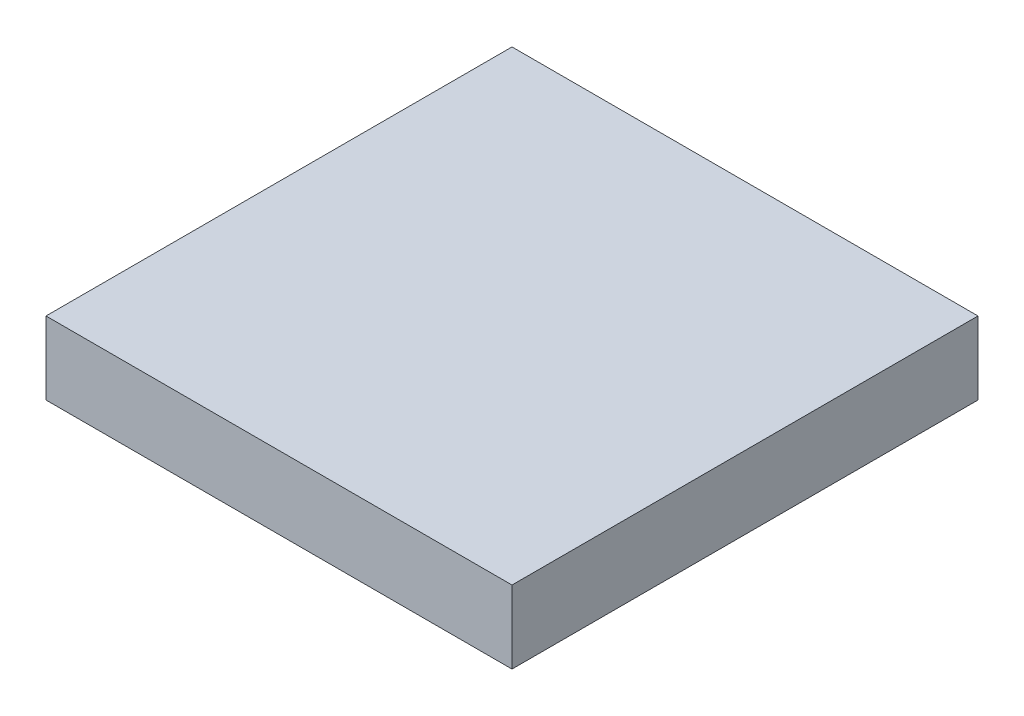
ISO-10303-21;
HEADER;
FILE_DESCRIPTION(('STEP AP214'),'2;1');
FILE_NAME('part.step','',(''),(''),'','','');
FILE_SCHEMA(('AUTOMOTIVE_DESIGN { 1 0 10303 214 1 1 1 1 }'));
ENDSEC;
DATA;
#1=APPLICATION_CONTEXT('core data for automotive mechanical design processes');
#2=APPLICATION_PROTOCOL_DEFINITION('international standard','automotive_design',2000,#1);
#3=PRODUCT_CONTEXT('',#1,'mechanical');
#4=PRODUCT('Part','Part','',(#3));
#5=PRODUCT_RELATED_PRODUCT_CATEGORY('part','',(#4));
#6=PRODUCT_DEFINITION_FORMATION('','',#4);
#7=PRODUCT_DEFINITION_CONTEXT('part definition',#1,'design');
#8=PRODUCT_DEFINITION('design','',#6,#7);
#9=PRODUCT_DEFINITION_SHAPE('','',#8);
#10=(LENGTH_UNIT() NAMED_UNIT(*) SI_UNIT(.MILLI.,.METRE.));
#11=(NAMED_UNIT(*) PLANE_ANGLE_UNIT() SI_UNIT($,.RADIAN.));
#12=(NAMED_UNIT(*) SI_UNIT($,.STERADIAN.) SOLID_ANGLE_UNIT());
#13=UNCERTAINTY_MEASURE_WITH_UNIT(LENGTH_MEASURE(1.E-05),#10,'distance_accuracy_value','');
#14=(GEOMETRIC_REPRESENTATION_CONTEXT(3) GLOBAL_UNCERTAINTY_ASSIGNED_CONTEXT((#13)) GLOBAL_UNIT_ASSIGNED_CONTEXT((#10,
#11,#12)) REPRESENTATION_CONTEXT('',''));
#15=CARTESIAN_POINT('',(0.,0.,0.));
#16=DIRECTION('',(0.,0.,1.));
#17=DIRECTION('',(1.,0.,0.));
#18=AXIS2_PLACEMENT_3D('',#15,#16,#17);
#19=CARTESIAN_POINT('',(-31.9999999999999,25.,64.5));
#20=DIRECTION('',(1.,0.,0.));
#21=DIRECTION('',(0.,0.,-1.));
#22=AXIS2_PLACEMENT_3D('',#19,#20,#21);
#23=PLANE('',#22);
#24=DIRECTION('',(0.,0.,1.));
#25=VECTOR('',#24,1.);
#26=CARTESIAN_POINT('',(-31.9999999999999,15.,64.5));
#27=LINE('',#26,#25);
#28=CARTESIAN_POINT('',(-31.9999999999999,15.,0.499999999999999));
#29=VERTEX_POINT('',#28);
#30=CARTESIAN_POINT('',(-31.9999999999999,15.,64.5));
#31=VERTEX_POINT('',#30);
#32=EDGE_CURVE('E102',#29,#31,#27,.T.);
#33=ORIENTED_EDGE('',*,*,#32,.T.);
#34=DIRECTION('',(0.,-1.,0.));
#35=VECTOR('',#34,1.);
#36=CARTESIAN_POINT('',(-31.9999999999999,25.,64.5));
#37=LINE('',#36,#35);
#38=CARTESIAN_POINT('',(-31.9999999999999,25.,64.5));
#39=VERTEX_POINT('',#38);
#40=EDGE_CURVE('E11',#39,#31,#37,.T.);
#41=ORIENTED_EDGE('',*,*,#40,.F.);
#42=DIRECTION('',(0.,0.,1.));
#43=VECTOR('',#42,1.);
#44=CARTESIAN_POINT('',(-31.9999999999999,25.,64.5));
#45=LINE('',#44,#43);
#46=CARTESIAN_POINT('',(-31.9999999999999,25.,0.499999999999999));
#47=VERTEX_POINT('',#46);
#48=EDGE_CURVE('E90',#47,#39,#45,.T.);
#49=ORIENTED_EDGE('',*,*,#48,.F.);
#50=DIRECTION('',(0.,-1.,0.));
#51=VECTOR('',#50,1.);
#52=CARTESIAN_POINT('',(-31.9999999999999,25.,0.499999999999999));
#53=LINE('',#52,#51);
#54=EDGE_CURVE('E98',#47,#29,#53,.T.);
#55=ORIENTED_EDGE('',*,*,#54,.T.);
#56=EDGE_LOOP('',(#33,#41,#49,#55));
#57=FACE_BOUND('',#56,.T.);
#58=ADVANCED_FACE('F39',(#57),#23,.F.);
#59=CARTESIAN_POINT('',(32.,25.,64.5));
#60=DIRECTION('',(0.,0.,-1.));
#61=DIRECTION('',(-1.,0.,0.));
#62=AXIS2_PLACEMENT_3D('',#59,#60,#61);
#63=PLANE('',#62);
#64=DIRECTION('',(1.,0.,0.));
#65=VECTOR('',#64,1.);
#66=CARTESIAN_POINT('',(32.,15.,64.5));
#67=LINE('',#66,#65);
#68=CARTESIAN_POINT('',(32.,15.,64.5));
#69=VERTEX_POINT('',#68);
#70=EDGE_CURVE('E94',#31,#69,#67,.T.);
#71=ORIENTED_EDGE('',*,*,#70,.T.);
#72=DIRECTION('',(0.,-1.,0.));
#73=VECTOR('',#72,1.);
#74=CARTESIAN_POINT('',(32.,25.,64.5));
#75=LINE('',#74,#73);
#76=CARTESIAN_POINT('',(32.,25.,64.5));
#77=VERTEX_POINT('',#76);
#78=EDGE_CURVE('E47',#77,#69,#75,.T.);
#79=ORIENTED_EDGE('',*,*,#78,.F.);
#80=DIRECTION('',(1.,0.,0.));
#81=VECTOR('',#80,1.);
#82=CARTESIAN_POINT('',(32.,25.,64.5));
#83=LINE('',#82,#81);
#84=EDGE_CURVE('E85',#39,#77,#83,.T.);
#85=ORIENTED_EDGE('',*,*,#84,.F.);
#86=ORIENTED_EDGE('',*,*,#40,.T.);
#87=EDGE_LOOP('',(#71,#79,#85,#86));
#88=FACE_BOUND('',#87,.T.);
#89=ADVANCED_FACE('F93',(#88),#63,.F.);
#90=CARTESIAN_POINT('',(32.,25.,0.499999999999997));
#91=DIRECTION('',(-1.,0.,0.));
#92=DIRECTION('',(0.,0.,1.));
#93=AXIS2_PLACEMENT_3D('',#90,#91,#92);
#94=PLANE('',#93);
#95=DIRECTION('',(0.,0.,-1.));
#96=VECTOR('',#95,1.);
#97=CARTESIAN_POINT('',(32.,15.,0.499999999999997));
#98=LINE('',#97,#96);
#99=CARTESIAN_POINT('',(32.,15.,0.499999999999997));
#100=VERTEX_POINT('',#99);
#101=EDGE_CURVE('E72',#69,#100,#98,.T.);
#102=ORIENTED_EDGE('',*,*,#101,.T.);
#103=DIRECTION('',(0.,-1.,0.));
#104=VECTOR('',#103,1.);
#105=CARTESIAN_POINT('',(32.,25.,0.499999999999997));
#106=LINE('',#105,#104);
#107=CARTESIAN_POINT('',(32.,25.,0.499999999999997));
#108=VERTEX_POINT('',#107);
#109=EDGE_CURVE('E95',#108,#100,#106,.T.);
#110=ORIENTED_EDGE('',*,*,#109,.F.);
#111=DIRECTION('',(0.,0.,-1.));
#112=VECTOR('',#111,1.);
#113=CARTESIAN_POINT('',(32.,25.,0.499999999999997));
#114=LINE('',#113,#112);
#115=EDGE_CURVE('E88',#77,#108,#114,.T.);
#116=ORIENTED_EDGE('',*,*,#115,.F.);
#117=ORIENTED_EDGE('',*,*,#78,.T.);
#118=EDGE_LOOP('',(#102,#110,#116,#117));
#119=FACE_BOUND('',#118,.T.);
#120=ADVANCED_FACE('F96',(#119),#94,.F.);
#121=CARTESIAN_POINT('',(-31.9999999999999,25.,0.499999999999999));
#122=DIRECTION('',(0.,0.,1.));
#123=DIRECTION('',(1.,0.,0.));
#124=AXIS2_PLACEMENT_3D('',#121,#122,#123);
#125=PLANE('',#124);
#126=DIRECTION('',(-1.,0.,0.));
#127=VECTOR('',#126,1.);
#128=CARTESIAN_POINT('',(-31.9999999999999,15.,0.499999999999999));
#129=LINE('',#128,#127);
#130=EDGE_CURVE('E78',#100,#29,#129,.T.);
#131=ORIENTED_EDGE('',*,*,#130,.T.);
#132=ORIENTED_EDGE('',*,*,#54,.F.);
#133=DIRECTION('',(-1.,0.,0.));
#134=VECTOR('',#133,1.);
#135=CARTESIAN_POINT('',(-31.9999999999999,25.,0.499999999999999));
#136=LINE('',#135,#134);
#137=EDGE_CURVE('E55',#108,#47,#136,.T.);
#138=ORIENTED_EDGE('',*,*,#137,.F.);
#139=ORIENTED_EDGE('',*,*,#109,.T.);
#140=EDGE_LOOP('',(#131,#132,#138,#139));
#141=FACE_BOUND('',#140,.T.);
#142=ADVANCED_FACE('F109',(#141),#125,.F.);
#143=CARTESIAN_POINT('',(0.,25.,0.));
#144=DIRECTION('',(0.,-1.,0.));
#145=DIRECTION('',(0.,0.,-1.));
#146=AXIS2_PLACEMENT_3D('',#143,#144,#145);
#147=PLANE('',#146);
#148=ORIENTED_EDGE('',*,*,#48,.T.);
#149=ORIENTED_EDGE('',*,*,#84,.T.);
#150=ORIENTED_EDGE('',*,*,#115,.T.);
#151=ORIENTED_EDGE('',*,*,#137,.T.);
#152=EDGE_LOOP('',(#148,#149,#150,#151));
#153=FACE_BOUND('',#152,.T.);
#154=ADVANCED_FACE('F86',(#153),#147,.F.);
#155=CARTESIAN_POINT('',(0.,15.,0.));
#156=DIRECTION('',(0.,-1.,0.));
#157=DIRECTION('',(0.,0.,-1.));
#158=AXIS2_PLACEMENT_3D('',#155,#156,#157);
#159=PLANE('',#158);
#160=ORIENTED_EDGE('',*,*,#32,.F.);
#161=ORIENTED_EDGE('',*,*,#130,.F.);
#162=ORIENTED_EDGE('',*,*,#101,.F.);
#163=ORIENTED_EDGE('',*,*,#70,.F.);
#164=EDGE_LOOP('',(#160,#161,#162,#163));
#165=FACE_BOUND('',#164,.T.);
#166=ADVANCED_FACE('F112',(#165),#159,.T.);
#167=CLOSED_SHELL('',(#58,#89,#120,#142,#154,#166));
#168=MANIFOLD_SOLID_BREP('B2',#167);
#169=ADVANCED_BREP_SHAPE_REPRESENTATION('',(#18,#168),#14);
#170=SHAPE_DEFINITION_REPRESENTATION(#9,#169);
ENDSEC;
END-ISO-10303-21;
